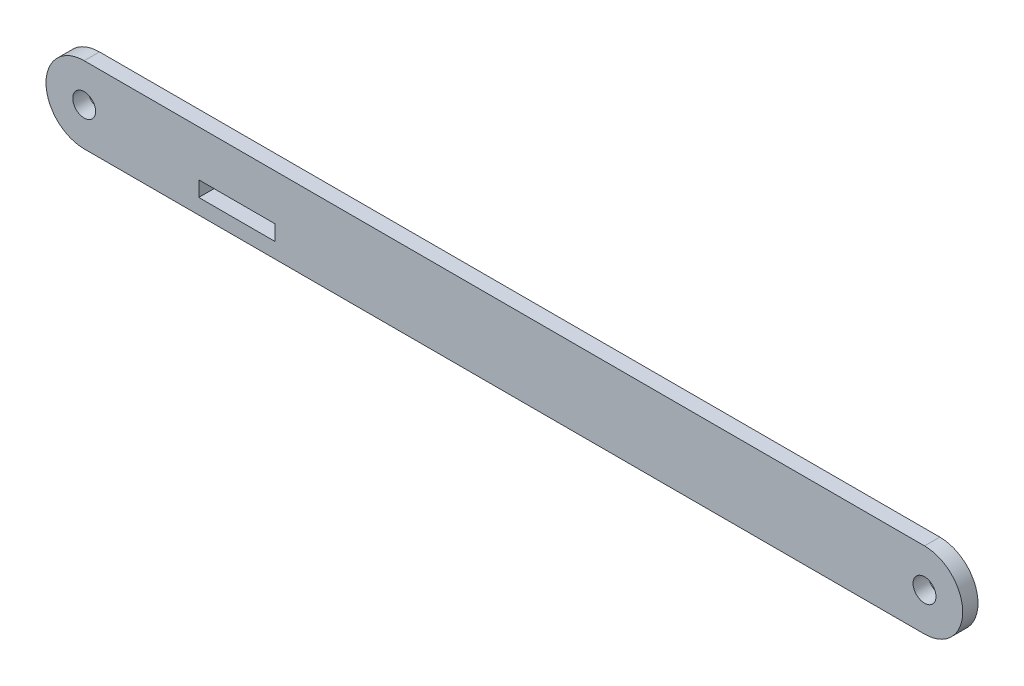
ISO-10303-21;
HEADER;
FILE_DESCRIPTION(('STEP AP214'),'2;1');
FILE_NAME('part.step','',(''),(''),'','','');
FILE_SCHEMA(('AUTOMOTIVE_DESIGN { 1 0 10303 214 1 1 1 1 }'));
ENDSEC;
DATA;
#1=APPLICATION_CONTEXT('core data for automotive mechanical design processes');
#2=APPLICATION_PROTOCOL_DEFINITION('international standard','automotive_design',2000,#1);
#3=PRODUCT_CONTEXT('',#1,'mechanical');
#4=PRODUCT('Part','Part','',(#3));
#5=PRODUCT_RELATED_PRODUCT_CATEGORY('part','',(#4));
#6=PRODUCT_DEFINITION_FORMATION('','',#4);
#7=PRODUCT_DEFINITION_CONTEXT('part definition',#1,'design');
#8=PRODUCT_DEFINITION('design','',#6,#7);
#9=PRODUCT_DEFINITION_SHAPE('','',#8);
#10=(LENGTH_UNIT() NAMED_UNIT(*) SI_UNIT(.MILLI.,.METRE.));
#11=(NAMED_UNIT(*) PLANE_ANGLE_UNIT() SI_UNIT($,.RADIAN.));
#12=(NAMED_UNIT(*) SI_UNIT($,.STERADIAN.) SOLID_ANGLE_UNIT());
#13=UNCERTAINTY_MEASURE_WITH_UNIT(LENGTH_MEASURE(1.E-05),#10,'distance_accuracy_value','');
#14=(GEOMETRIC_REPRESENTATION_CONTEXT(3) GLOBAL_UNCERTAINTY_ASSIGNED_CONTEXT((#13)) GLOBAL_UNIT_ASSIGNED_CONTEXT((#10,
#11,#12)) REPRESENTATION_CONTEXT('',''));
#15=CARTESIAN_POINT('',(0.,0.,0.));
#16=DIRECTION('',(0.,0.,1.));
#17=DIRECTION('',(1.,0.,0.));
#18=AXIS2_PLACEMENT_3D('',#15,#16,#17);
#19=CARTESIAN_POINT('',(55.,-20.,0.));
#20=DIRECTION('',(0.,0.,-1.));
#21=DIRECTION('',(1.,0.,0.));
#22=AXIS2_PLACEMENT_3D('',#19,#20,#21);
#23=CYLINDRICAL_SURFACE('',#22,1.5);
#24=DIRECTION('',(0.,0.,1.));
#25=VECTOR('',#24,1.);
#26=CARTESIAN_POINT('',(56.5,-20.,0.));
#27=LINE('',#26,#25);
#28=CARTESIAN_POINT('',(56.5,-20.,0.));
#29=VERTEX_POINT('',#28);
#30=CARTESIAN_POINT('',(56.5,-20.,2.));
#31=VERTEX_POINT('',#30);
#32=EDGE_CURVE('E9',#29,#31,#27,.T.);
#33=ORIENTED_EDGE('',*,*,#32,.T.);
#34=CARTESIAN_POINT('',(55.,-20.,2.));
#35=DIRECTION('',(0.,0.,1.));
#36=DIRECTION('',(1.,0.,0.));
#37=AXIS2_PLACEMENT_3D('',#34,#35,#36);
#38=CIRCLE('',#37,1.5);
#39=EDGE_CURVE('E173',#31,#31,#38,.T.);
#40=ORIENTED_EDGE('',*,*,#39,.T.);
#41=ORIENTED_EDGE('',*,*,#32,.F.);
#42=CARTESIAN_POINT('',(55.,-20.,0.));
#43=DIRECTION('',(0.,0.,1.));
#44=DIRECTION('',(1.,0.,0.));
#45=AXIS2_PLACEMENT_3D('',#42,#43,#44);
#46=CIRCLE('',#45,1.5);
#47=EDGE_CURVE('E130',#29,#29,#46,.T.);
#48=ORIENTED_EDGE('',*,*,#47,.F.);
#49=EDGE_LOOP('',(#33,#40,#41,#48));
#50=FACE_BOUND('',#49,.T.);
#51=ADVANCED_FACE('F14',(#50),#23,.F.);
#52=CARTESIAN_POINT('',(-55.,-20.,0.));
#53=DIRECTION('',(0.,0.,-1.));
#54=DIRECTION('',(1.,0.,0.));
#55=AXIS2_PLACEMENT_3D('',#52,#53,#54);
#56=CYLINDRICAL_SURFACE('',#55,1.5);
#57=DIRECTION('',(0.,0.,1.));
#58=VECTOR('',#57,1.);
#59=CARTESIAN_POINT('',(-53.5,-20.,0.));
#60=LINE('',#59,#58);
#61=CARTESIAN_POINT('',(-53.5,-20.,0.));
#62=VERTEX_POINT('',#61);
#63=CARTESIAN_POINT('',(-53.5,-20.,2.));
#64=VERTEX_POINT('',#63);
#65=EDGE_CURVE('E25',#62,#64,#60,.T.);
#66=ORIENTED_EDGE('',*,*,#65,.T.);
#67=CARTESIAN_POINT('',(-55.,-20.,2.));
#68=DIRECTION('',(0.,0.,1.));
#69=DIRECTION('',(1.,0.,0.));
#70=AXIS2_PLACEMENT_3D('',#67,#68,#69);
#71=CIRCLE('',#70,1.5);
#72=EDGE_CURVE('E123',#64,#64,#71,.T.);
#73=ORIENTED_EDGE('',*,*,#72,.T.);
#74=ORIENTED_EDGE('',*,*,#65,.F.);
#75=CARTESIAN_POINT('',(-55.,-20.,0.));
#76=DIRECTION('',(0.,0.,1.));
#77=DIRECTION('',(1.,0.,0.));
#78=AXIS2_PLACEMENT_3D('',#75,#76,#77);
#79=CIRCLE('',#78,1.5);
#80=EDGE_CURVE('E121',#62,#62,#79,.T.);
#81=ORIENTED_EDGE('',*,*,#80,.F.);
#82=EDGE_LOOP('',(#66,#73,#74,#81));
#83=FACE_BOUND('',#82,.T.);
#84=ADVANCED_FACE('F120',(#83),#56,.F.);
#85=CARTESIAN_POINT('',(-30.,-21.,2.));
#86=DIRECTION('',(0.,1.,0.));
#87=DIRECTION('',(1.,0.,0.));
#88=AXIS2_PLACEMENT_3D('',#85,#86,#87);
#89=PLANE('',#88);
#90=DIRECTION('',(-1.,0.,0.));
#91=VECTOR('',#90,1.);
#92=CARTESIAN_POINT('',(-30.,-21.,2.));
#93=LINE('',#92,#91);
#94=CARTESIAN_POINT('',(-30.,-21.,2.));
#95=VERTEX_POINT('',#94);
#96=CARTESIAN_POINT('',(-40.,-21.,2.));
#97=VERTEX_POINT('',#96);
#98=EDGE_CURVE('E162',#95,#97,#93,.T.);
#99=ORIENTED_EDGE('',*,*,#98,.T.);
#100=DIRECTION('',(0.,0.,-1.));
#101=VECTOR('',#100,1.);
#102=CARTESIAN_POINT('',(-40.,-21.,2.));
#103=LINE('',#102,#101);
#104=CARTESIAN_POINT('',(-40.,-21.,0.));
#105=VERTEX_POINT('',#104);
#106=EDGE_CURVE('E159',#97,#105,#103,.T.);
#107=ORIENTED_EDGE('',*,*,#106,.T.);
#108=DIRECTION('',(-1.,0.,0.));
#109=VECTOR('',#108,1.);
#110=CARTESIAN_POINT('',(-30.,-21.,0.));
#111=LINE('',#110,#109);
#112=CARTESIAN_POINT('',(-30.,-21.,0.));
#113=VERTEX_POINT('',#112);
#114=EDGE_CURVE('E141',#113,#105,#111,.T.);
#115=ORIENTED_EDGE('',*,*,#114,.F.);
#116=DIRECTION('',(0.,0.,-1.));
#117=VECTOR('',#116,1.);
#118=CARTESIAN_POINT('',(-30.,-21.,2.));
#119=LINE('',#118,#117);
#120=EDGE_CURVE('E125',#95,#113,#119,.T.);
#121=ORIENTED_EDGE('',*,*,#120,.F.);
#122=EDGE_LOOP('',(#99,#107,#115,#121));
#123=FACE_BOUND('',#122,.T.);
#124=ADVANCED_FACE('F260',(#123),#89,.F.);
#125=CARTESIAN_POINT('',(-30.,-23.,2.));
#126=DIRECTION('',(1.,0.,0.));
#127=DIRECTION('',(0.,1.,0.));
#128=AXIS2_PLACEMENT_3D('',#125,#126,#127);
#129=PLANE('',#128);
#130=DIRECTION('',(0.,1.,0.));
#131=VECTOR('',#130,1.);
#132=CARTESIAN_POINT('',(-30.,-23.,2.));
#133=LINE('',#132,#131);
#134=CARTESIAN_POINT('',(-30.,-23.,2.));
#135=VERTEX_POINT('',#134);
#136=EDGE_CURVE('E150',#135,#95,#133,.T.);
#137=ORIENTED_EDGE('',*,*,#136,.T.);
#138=ORIENTED_EDGE('',*,*,#120,.T.);
#139=DIRECTION('',(0.,1.,0.));
#140=VECTOR('',#139,1.);
#141=CARTESIAN_POINT('',(-30.,-23.,0.));
#142=LINE('',#141,#140);
#143=CARTESIAN_POINT('',(-30.,-23.,0.));
#144=VERTEX_POINT('',#143);
#145=EDGE_CURVE('E151',#144,#113,#142,.T.);
#146=ORIENTED_EDGE('',*,*,#145,.F.);
#147=DIRECTION('',(0.,0.,-1.));
#148=VECTOR('',#147,1.);
#149=CARTESIAN_POINT('',(-30.,-23.,2.));
#150=LINE('',#149,#148);
#151=EDGE_CURVE('E156',#135,#144,#150,.T.);
#152=ORIENTED_EDGE('',*,*,#151,.F.);
#153=EDGE_LOOP('',(#137,#138,#146,#152));
#154=FACE_BOUND('',#153,.T.);
#155=ADVANCED_FACE('F257',(#154),#129,.F.);
#156=CARTESIAN_POINT('',(-40.,-23.,2.));
#157=DIRECTION('',(0.,-1.,0.));
#158=DIRECTION('',(0.,0.,-1.));
#159=AXIS2_PLACEMENT_3D('',#156,#157,#158);
#160=PLANE('',#159);
#161=DIRECTION('',(1.,0.,0.));
#162=VECTOR('',#161,1.);
#163=CARTESIAN_POINT('',(-40.,-23.,2.));
#164=LINE('',#163,#162);
#165=CARTESIAN_POINT('',(-40.,-23.,2.));
#166=VERTEX_POINT('',#165);
#167=EDGE_CURVE('E146',#166,#135,#164,.T.);
#168=ORIENTED_EDGE('',*,*,#167,.T.);
#169=ORIENTED_EDGE('',*,*,#151,.T.);
#170=DIRECTION('',(1.,0.,0.));
#171=VECTOR('',#170,1.);
#172=CARTESIAN_POINT('',(-40.,-23.,0.));
#173=LINE('',#172,#171);
#174=CARTESIAN_POINT('',(-40.,-23.,0.));
#175=VERTEX_POINT('',#174);
#176=EDGE_CURVE('E154',#175,#144,#173,.T.);
#177=ORIENTED_EDGE('',*,*,#176,.F.);
#178=DIRECTION('',(0.,0.,-1.));
#179=VECTOR('',#178,1.);
#180=CARTESIAN_POINT('',(-40.,-23.,2.));
#181=LINE('',#180,#179);
#182=EDGE_CURVE('E170',#166,#175,#181,.T.);
#183=ORIENTED_EDGE('',*,*,#182,.F.);
#184=EDGE_LOOP('',(#168,#169,#177,#183));
#185=FACE_BOUND('',#184,.T.);
#186=ADVANCED_FACE('F253',(#185),#160,.F.);
#187=CARTESIAN_POINT('',(-40.,-21.,2.));
#188=DIRECTION('',(-1.,0.,0.));
#189=DIRECTION('',(0.,0.,1.));
#190=AXIS2_PLACEMENT_3D('',#187,#188,#189);
#191=PLANE('',#190);
#192=DIRECTION('',(0.,-1.,0.));
#193=VECTOR('',#192,1.);
#194=CARTESIAN_POINT('',(-40.,-21.,2.));
#195=LINE('',#194,#193);
#196=EDGE_CURVE('E194',#97,#166,#195,.T.);
#197=ORIENTED_EDGE('',*,*,#196,.T.);
#198=ORIENTED_EDGE('',*,*,#182,.T.);
#199=DIRECTION('',(0.,-1.,0.));
#200=VECTOR('',#199,1.);
#201=CARTESIAN_POINT('',(-40.,-21.,0.));
#202=LINE('',#201,#200);
#203=EDGE_CURVE('E131',#105,#175,#202,.T.);
#204=ORIENTED_EDGE('',*,*,#203,.F.);
#205=ORIENTED_EDGE('',*,*,#106,.F.);
#206=EDGE_LOOP('',(#197,#198,#204,#205));
#207=FACE_BOUND('',#206,.T.);
#208=ADVANCED_FACE('F348',(#207),#191,.F.);
#209=CARTESIAN_POINT('',(55.,-20.,0.));
#210=DIRECTION('',(0.,0.,-1.));
#211=DIRECTION('',(1.,0.,0.));
#212=AXIS2_PLACEMENT_3D('',#209,#210,#211);
#213=CYLINDRICAL_SURFACE('',#212,4.999999999999);
#214=CARTESIAN_POINT('',(55.,-20.,0.));
#215=DIRECTION('',(0.,0.,1.));
#216=DIRECTION('',(1.,0.,0.));
#217=AXIS2_PLACEMENT_3D('',#214,#215,#216);
#218=CIRCLE('',#217,4.999999999999);
#219=CARTESIAN_POINT('',(55.,-24.99999999999,0.));
#220=VERTEX_POINT('',#219);
#221=CARTESIAN_POINT('',(55.,-15.,0.));
#222=VERTEX_POINT('',#221);
#223=EDGE_CURVE('E106',#220,#222,#218,.T.);
#224=ORIENTED_EDGE('',*,*,#223,.T.);
#225=DIRECTION('',(0.,0.,1.));
#226=VECTOR('',#225,1.);
#227=CARTESIAN_POINT('',(55.,-15.,0.));
#228=LINE('',#227,#226);
#229=CARTESIAN_POINT('',(55.,-15.,2.));
#230=VERTEX_POINT('',#229);
#231=EDGE_CURVE('E178',#222,#230,#228,.T.);
#232=ORIENTED_EDGE('',*,*,#231,.T.);
#233=CARTESIAN_POINT('',(55.,-20.,2.));
#234=DIRECTION('',(0.,0.,1.));
#235=DIRECTION('',(1.,0.,0.));
#236=AXIS2_PLACEMENT_3D('',#233,#234,#235);
#237=CIRCLE('',#236,4.999999999999);
#238=CARTESIAN_POINT('',(55.,-24.99999999999,2.));
#239=VERTEX_POINT('',#238);
#240=EDGE_CURVE('E18',#239,#230,#237,.T.);
#241=ORIENTED_EDGE('',*,*,#240,.F.);
#242=DIRECTION('',(0.,0.,1.));
#243=VECTOR('',#242,1.);
#244=CARTESIAN_POINT('',(55.,-24.99999999999,0.));
#245=LINE('',#244,#243);
#246=EDGE_CURVE('E182',#220,#239,#245,.T.);
#247=ORIENTED_EDGE('',*,*,#246,.F.);
#248=EDGE_LOOP('',(#224,#232,#241,#247));
#249=FACE_BOUND('',#248,.T.);
#250=ADVANCED_FACE('F222',(#249),#213,.T.);
#251=CARTESIAN_POINT('',(-3.7803E-13,-20.,2.));
#252=DIRECTION('',(0.,0.,1.));
#253=DIRECTION('',(1.,0.,0.));
#254=AXIS2_PLACEMENT_3D('',#251,#252,#253);
#255=PLANE('',#254);
#256=ORIENTED_EDGE('',*,*,#39,.F.);
#257=EDGE_LOOP('',(#256));
#258=FACE_BOUND('',#257,.T.);
#259=ORIENTED_EDGE('',*,*,#72,.F.);
#260=EDGE_LOOP('',(#259));
#261=FACE_BOUND('',#260,.T.);
#262=ORIENTED_EDGE('',*,*,#196,.F.);
#263=ORIENTED_EDGE('',*,*,#98,.F.);
#264=ORIENTED_EDGE('',*,*,#136,.F.);
#265=ORIENTED_EDGE('',*,*,#167,.F.);
#266=EDGE_LOOP('',(#262,#263,#264,#265));
#267=FACE_BOUND('',#266,.T.);
#268=CARTESIAN_POINT('',(-55.,-20.,2.));
#269=DIRECTION('',(0.,0.,1.));
#270=DIRECTION('',(1.,0.,0.));
#271=AXIS2_PLACEMENT_3D('',#268,#269,#270);
#272=CIRCLE('',#271,4.999999999999);
#273=CARTESIAN_POINT('',(-55.,-15.,2.));
#274=VERTEX_POINT('',#273);
#275=CARTESIAN_POINT('',(-55.00000000001,-24.99999999999,2.));
#276=VERTEX_POINT('',#275);
#277=EDGE_CURVE('E177',#274,#276,#272,.T.);
#278=ORIENTED_EDGE('',*,*,#277,.T.);
#279=DIRECTION('',(1.,0.,0.));
#280=VECTOR('',#279,1.);
#281=CARTESIAN_POINT('',(-55.00000000001,-24.99999999999,2.));
#282=LINE('',#281,#280);
#283=EDGE_CURVE('E185',#276,#239,#282,.T.);
#284=ORIENTED_EDGE('',*,*,#283,.T.);
#285=ORIENTED_EDGE('',*,*,#240,.T.);
#286=DIRECTION('',(-1.,0.,0.));
#287=VECTOR('',#286,1.);
#288=CARTESIAN_POINT('',(55.,-15.,2.));
#289=LINE('',#288,#287);
#290=EDGE_CURVE('E168',#230,#274,#289,.T.);
#291=ORIENTED_EDGE('',*,*,#290,.T.);
#292=EDGE_LOOP('',(#278,#284,#285,#291));
#293=FACE_BOUND('',#292,.T.);
#294=ADVANCED_FACE('F16',(#258,#261,#267,#293),#255,.T.);
#295=CARTESIAN_POINT('',(-3.7803E-13,-20.,0.));
#296=DIRECTION('',(0.,0.,1.));
#297=DIRECTION('',(1.,0.,0.));
#298=AXIS2_PLACEMENT_3D('',#295,#296,#297);
#299=PLANE('',#298);
#300=ORIENTED_EDGE('',*,*,#47,.T.);
#301=EDGE_LOOP('',(#300));
#302=FACE_BOUND('',#301,.T.);
#303=ORIENTED_EDGE('',*,*,#80,.T.);
#304=EDGE_LOOP('',(#303));
#305=FACE_BOUND('',#304,.T.);
#306=ORIENTED_EDGE('',*,*,#176,.T.);
#307=ORIENTED_EDGE('',*,*,#145,.T.);
#308=ORIENTED_EDGE('',*,*,#114,.T.);
#309=ORIENTED_EDGE('',*,*,#203,.T.);
#310=EDGE_LOOP('',(#306,#307,#308,#309));
#311=FACE_BOUND('',#310,.T.);
#312=DIRECTION('',(-1.,0.,0.));
#313=VECTOR('',#312,1.);
#314=CARTESIAN_POINT('',(55.,-15.,0.));
#315=LINE('',#314,#313);
#316=CARTESIAN_POINT('',(-55.,-15.,0.));
#317=VERTEX_POINT('',#316);
#318=EDGE_CURVE('E164',#222,#317,#315,.T.);
#319=ORIENTED_EDGE('',*,*,#318,.F.);
#320=ORIENTED_EDGE('',*,*,#223,.F.);
#321=DIRECTION('',(1.,0.,0.));
#322=VECTOR('',#321,1.);
#323=CARTESIAN_POINT('',(-55.00000000001,-24.99999999999,0.));
#324=LINE('',#323,#322);
#325=CARTESIAN_POINT('',(-55.00000000001,-24.99999999999,0.));
#326=VERTEX_POINT('',#325);
#327=EDGE_CURVE('E181',#326,#220,#324,.T.);
#328=ORIENTED_EDGE('',*,*,#327,.F.);
#329=CARTESIAN_POINT('',(-55.,-20.,0.));
#330=DIRECTION('',(0.,0.,1.));
#331=DIRECTION('',(1.,0.,0.));
#332=AXIS2_PLACEMENT_3D('',#329,#330,#331);
#333=CIRCLE('',#332,4.999999999999);
#334=EDGE_CURVE('E209',#317,#326,#333,.T.);
#335=ORIENTED_EDGE('',*,*,#334,.F.);
#336=EDGE_LOOP('',(#319,#320,#328,#335));
#337=FACE_BOUND('',#336,.T.);
#338=ADVANCED_FACE('F127',(#302,#305,#311,#337),#299,.F.);
#339=CARTESIAN_POINT('',(-55.00000000001,-24.99999999999,0.));
#340=DIRECTION('',(0.,1.,0.));
#341=DIRECTION('',(1.,0.,0.));
#342=AXIS2_PLACEMENT_3D('',#339,#340,#341);
#343=PLANE('',#342);
#344=ORIENTED_EDGE('',*,*,#327,.T.);
#345=ORIENTED_EDGE('',*,*,#246,.T.);
#346=ORIENTED_EDGE('',*,*,#283,.F.);
#347=DIRECTION('',(0.,0.,1.));
#348=VECTOR('',#347,1.);
#349=CARTESIAN_POINT('',(-55.00000000001,-24.99999999999,0.));
#350=LINE('',#349,#348);
#351=EDGE_CURVE('E205',#326,#276,#350,.T.);
#352=ORIENTED_EDGE('',*,*,#351,.F.);
#353=EDGE_LOOP('',(#344,#345,#346,#352));
#354=FACE_BOUND('',#353,.T.);
#355=ADVANCED_FACE('F238',(#354),#343,.F.);
#356=CARTESIAN_POINT('',(55.,-15.,0.));
#357=DIRECTION('',(0.,-1.,0.));
#358=DIRECTION('',(0.,0.,-1.));
#359=AXIS2_PLACEMENT_3D('',#356,#357,#358);
#360=PLANE('',#359);
#361=ORIENTED_EDGE('',*,*,#318,.T.);
#362=DIRECTION('',(0.,0.,1.));
#363=VECTOR('',#362,1.);
#364=CARTESIAN_POINT('',(-55.,-15.,0.));
#365=LINE('',#364,#363);
#366=EDGE_CURVE('E169',#317,#274,#365,.T.);
#367=ORIENTED_EDGE('',*,*,#366,.T.);
#368=ORIENTED_EDGE('',*,*,#290,.F.);
#369=ORIENTED_EDGE('',*,*,#231,.F.);
#370=EDGE_LOOP('',(#361,#367,#368,#369));
#371=FACE_BOUND('',#370,.T.);
#372=ADVANCED_FACE('F412',(#371),#360,.F.);
#373=CARTESIAN_POINT('',(-55.,-20.,0.));
#374=DIRECTION('',(0.,0.,-1.));
#375=DIRECTION('',(1.,0.,0.));
#376=AXIS2_PLACEMENT_3D('',#373,#374,#375);
#377=CYLINDRICAL_SURFACE('',#376,4.999999999999);
#378=ORIENTED_EDGE('',*,*,#334,.T.);
#379=ORIENTED_EDGE('',*,*,#351,.T.);
#380=ORIENTED_EDGE('',*,*,#277,.F.);
#381=ORIENTED_EDGE('',*,*,#366,.F.);
#382=EDGE_LOOP('',(#378,#379,#380,#381));
#383=FACE_BOUND('',#382,.T.);
#384=ADVANCED_FACE('F235',(#383),#377,.T.);
#385=CLOSED_SHELL('',(#51,#84,#124,#155,#186,#208,#250,#294,#338,#355,#372,#384));
#386=MANIFOLD_SOLID_BREP('B1',#385);
#387=ADVANCED_BREP_SHAPE_REPRESENTATION('',(#18,#386),#14);
#388=SHAPE_DEFINITION_REPRESENTATION(#9,#387);
ENDSEC;
END-ISO-10303-21;
